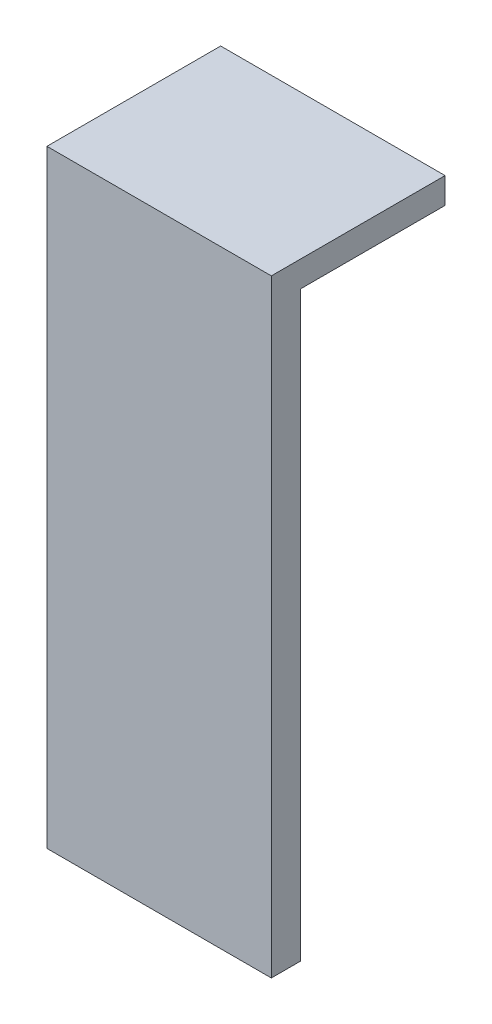
ISO-10303-21;
HEADER;
FILE_DESCRIPTION(('STEP AP214'),'2;1');
FILE_NAME('part.step','',(''),(''),'','','');
FILE_SCHEMA(('AUTOMOTIVE_DESIGN { 1 0 10303 214 1 1 1 1 }'));
ENDSEC;
DATA;
#1=APPLICATION_CONTEXT('core data for automotive mechanical design processes');
#2=APPLICATION_PROTOCOL_DEFINITION('international standard','automotive_design',2000,#1);
#3=PRODUCT_CONTEXT('',#1,'mechanical');
#4=PRODUCT('Part','Part','',(#3));
#5=PRODUCT_RELATED_PRODUCT_CATEGORY('part','',(#4));
#6=PRODUCT_DEFINITION_FORMATION('','',#4);
#7=PRODUCT_DEFINITION_CONTEXT('part definition',#1,'design');
#8=PRODUCT_DEFINITION('design','',#6,#7);
#9=PRODUCT_DEFINITION_SHAPE('','',#8);
#10=(LENGTH_UNIT() NAMED_UNIT(*) SI_UNIT(.MILLI.,.METRE.));
#11=(NAMED_UNIT(*) PLANE_ANGLE_UNIT() SI_UNIT($,.RADIAN.));
#12=(NAMED_UNIT(*) SI_UNIT($,.STERADIAN.) SOLID_ANGLE_UNIT());
#13=UNCERTAINTY_MEASURE_WITH_UNIT(LENGTH_MEASURE(1.E-05),#10,'distance_accuracy_value','');
#14=(GEOMETRIC_REPRESENTATION_CONTEXT(3) GLOBAL_UNCERTAINTY_ASSIGNED_CONTEXT((#13)) GLOBAL_UNIT_ASSIGNED_CONTEXT((#10,
#11,#12)) REPRESENTATION_CONTEXT('',''));
#15=CARTESIAN_POINT('',(0.,0.,0.));
#16=DIRECTION('',(0.,0.,1.));
#17=DIRECTION('',(1.,0.,0.));
#18=AXIS2_PLACEMENT_3D('',#15,#16,#17);
#19=CARTESIAN_POINT('',(-4.2545,21.336,-1.016));
#20=DIRECTION('',(0.,0.,1.));
#21=DIRECTION('',(1.,0.,0.));
#22=AXIS2_PLACEMENT_3D('',#19,#20,#21);
#23=PLANE('',#22);
#24=DIRECTION('',(-1.,0.,0.));
#25=VECTOR('',#24,1.);
#26=CARTESIAN_POINT('',(3.6195,20.42775542234,-1.016));
#27=LINE('',#26,#25);
#28=CARTESIAN_POINT('',(3.61949999999999,20.42775542234,-1.016));
#29=VERTEX_POINT('',#28);
#30=CARTESIAN_POINT('',(-4.2545,20.42775542234,-1.016));
#31=VERTEX_POINT('',#30);
#32=EDGE_CURVE('E48',#29,#31,#27,.T.);
#33=ORIENTED_EDGE('',*,*,#32,.F.);
#34=DIRECTION('',(0.,-1.,0.));
#35=VECTOR('',#34,1.);
#36=CARTESIAN_POINT('',(3.61949999999999,21.336,-1.016));
#37=LINE('',#36,#35);
#38=CARTESIAN_POINT('',(3.61949999999999,0.,-1.016));
#39=VERTEX_POINT('',#38);
#40=EDGE_CURVE('E84',#29,#39,#37,.T.);
#41=ORIENTED_EDGE('',*,*,#40,.T.);
#42=DIRECTION('',(-1.,0.,0.));
#43=VECTOR('',#42,1.);
#44=CARTESIAN_POINT('',(-4.2545,0.,-1.016));
#45=LINE('',#44,#43);
#46=CARTESIAN_POINT('',(-4.2545,0.,-1.016));
#47=VERTEX_POINT('',#46);
#48=EDGE_CURVE('E88',#39,#47,#45,.T.);
#49=ORIENTED_EDGE('',*,*,#48,.T.);
#50=DIRECTION('',(0.,-1.,0.));
#51=VECTOR('',#50,1.);
#52=CARTESIAN_POINT('',(-4.2545,21.336,-1.016));
#53=LINE('',#52,#51);
#54=EDGE_CURVE('E75',#31,#47,#53,.T.);
#55=ORIENTED_EDGE('',*,*,#54,.F.);
#56=EDGE_LOOP('',(#33,#41,#49,#55));
#57=FACE_BOUND('',#56,.T.);
#58=ADVANCED_FACE('F33',(#57),#23,.F.);
#59=CARTESIAN_POINT('',(-4.2545,21.336,-1.016));
#60=DIRECTION('',(1.,0.,0.));
#61=DIRECTION('',(0.,0.,-1.));
#62=AXIS2_PLACEMENT_3D('',#59,#60,#61);
#63=PLANE('',#62);
#64=DIRECTION('',(0.,0.,1.));
#65=VECTOR('',#64,1.);
#66=CARTESIAN_POINT('',(-4.2545,0.,-1.016));
#67=LINE('',#66,#65);
#68=CARTESIAN_POINT('',(-4.2545,0.,0.));
#69=VERTEX_POINT('',#68);
#70=EDGE_CURVE('E79',#47,#69,#67,.T.);
#71=ORIENTED_EDGE('',*,*,#70,.T.);
#72=DIRECTION('',(0.,-1.,0.));
#73=VECTOR('',#72,1.);
#74=CARTESIAN_POINT('',(-4.2545,21.336,0.));
#75=LINE('',#74,#73);
#76=CARTESIAN_POINT('',(-4.2545,21.336,0.));
#77=VERTEX_POINT('',#76);
#78=EDGE_CURVE('E11',#77,#69,#75,.T.);
#79=ORIENTED_EDGE('',*,*,#78,.F.);
#80=DIRECTION('',(0.,0.,1.));
#81=VECTOR('',#80,1.);
#82=CARTESIAN_POINT('',(-4.2545,21.336,-1.016));
#83=LINE('',#82,#81);
#84=CARTESIAN_POINT('',(-4.25450000000001,21.336,-6.096));
#85=VERTEX_POINT('',#84);
#86=EDGE_CURVE('E92',#85,#77,#83,.T.);
#87=ORIENTED_EDGE('',*,*,#86,.F.);
#88=DIRECTION('',(0.,1.,0.));
#89=VECTOR('',#88,1.);
#90=CARTESIAN_POINT('',(-4.25450000000001,21.336,-6.096));
#91=LINE('',#90,#89);
#92=CARTESIAN_POINT('',(-4.25450000000001,20.42775542234,-6.096));
#93=VERTEX_POINT('',#92);
#94=EDGE_CURVE('E117',#93,#85,#91,.T.);
#95=ORIENTED_EDGE('',*,*,#94,.F.);
#96=DIRECTION('',(0.,0.,1.));
#97=VECTOR('',#96,1.);
#98=CARTESIAN_POINT('',(-4.25450000000001,20.42775542234,-6.096));
#99=LINE('',#98,#97);
#100=EDGE_CURVE('E83',#93,#31,#99,.T.);
#101=ORIENTED_EDGE('',*,*,#100,.T.);
#102=ORIENTED_EDGE('',*,*,#54,.T.);
#103=EDGE_LOOP('',(#71,#79,#87,#95,#101,#102));
#104=FACE_BOUND('',#103,.T.);
#105=ADVANCED_FACE('F35',(#104),#63,.F.);
#106=CARTESIAN_POINT('',(-4.2545,21.336,0.));
#107=DIRECTION('',(0.,0.,-1.));
#108=DIRECTION('',(-1.,0.,0.));
#109=AXIS2_PLACEMENT_3D('',#106,#107,#108);
#110=PLANE('',#109);
#111=DIRECTION('',(1.,0.,0.));
#112=VECTOR('',#111,1.);
#113=CARTESIAN_POINT('',(-4.2545,0.,0.));
#114=LINE('',#113,#112);
#115=CARTESIAN_POINT('',(3.6195,0.,0.));
#116=VERTEX_POINT('',#115);
#117=EDGE_CURVE('E96',#69,#116,#114,.T.);
#118=ORIENTED_EDGE('',*,*,#117,.T.);
#119=DIRECTION('',(0.,-1.,0.));
#120=VECTOR('',#119,1.);
#121=CARTESIAN_POINT('',(3.6195,21.336,0.));
#122=LINE('',#121,#120);
#123=CARTESIAN_POINT('',(3.6195,21.336,0.));
#124=VERTEX_POINT('',#123);
#125=EDGE_CURVE('E41',#124,#116,#122,.T.);
#126=ORIENTED_EDGE('',*,*,#125,.F.);
#127=DIRECTION('',(1.,0.,0.));
#128=VECTOR('',#127,1.);
#129=CARTESIAN_POINT('',(-4.2545,21.336,0.));
#130=LINE('',#129,#128);
#131=EDGE_CURVE('E57',#77,#124,#130,.T.);
#132=ORIENTED_EDGE('',*,*,#131,.F.);
#133=ORIENTED_EDGE('',*,*,#78,.T.);
#134=EDGE_LOOP('',(#118,#126,#132,#133));
#135=FACE_BOUND('',#134,.T.);
#136=ADVANCED_FACE('F112',(#135),#110,.F.);
#137=CARTESIAN_POINT('',(3.61949999999999,21.336,-1.016));
#138=DIRECTION('',(-1.,0.,0.));
#139=DIRECTION('',(0.,0.,1.));
#140=AXIS2_PLACEMENT_3D('',#137,#138,#139);
#141=PLANE('',#140);
#142=DIRECTION('',(0.,0.,-1.));
#143=VECTOR('',#142,1.);
#144=CARTESIAN_POINT('',(3.61949999999999,0.,-1.016));
#145=LINE('',#144,#143);
#146=EDGE_CURVE('E93',#116,#39,#145,.T.);
#147=ORIENTED_EDGE('',*,*,#146,.T.);
#148=ORIENTED_EDGE('',*,*,#40,.F.);
#149=DIRECTION('',(0.,0.,1.));
#150=VECTOR('',#149,1.);
#151=CARTESIAN_POINT('',(3.61949999999999,20.42775542234,-6.09600000000001));
#152=LINE('',#151,#150);
#153=CARTESIAN_POINT('',(3.61949999999999,20.42775542234,-6.09600000000001));
#154=VERTEX_POINT('',#153);
#155=EDGE_CURVE('E97',#154,#29,#152,.T.);
#156=ORIENTED_EDGE('',*,*,#155,.F.);
#157=DIRECTION('',(0.,-1.,0.));
#158=VECTOR('',#157,1.);
#159=CARTESIAN_POINT('',(3.61949999999999,21.336,-6.09600000000001));
#160=LINE('',#159,#158);
#161=CARTESIAN_POINT('',(3.61949999999999,21.336,-6.09600000000001));
#162=VERTEX_POINT('',#161);
#163=EDGE_CURVE('E135',#162,#154,#160,.T.);
#164=ORIENTED_EDGE('',*,*,#163,.F.);
#165=DIRECTION('',(0.,0.,-1.));
#166=VECTOR('',#165,1.);
#167=CARTESIAN_POINT('',(3.61949999999999,21.336,-1.016));
#168=LINE('',#167,#166);
#169=EDGE_CURVE('E85',#124,#162,#168,.T.);
#170=ORIENTED_EDGE('',*,*,#169,.F.);
#171=ORIENTED_EDGE('',*,*,#125,.T.);
#172=EDGE_LOOP('',(#147,#148,#156,#164,#170,#171));
#173=FACE_BOUND('',#172,.T.);
#174=ADVANCED_FACE('F109',(#173),#141,.F.);
#175=CARTESIAN_POINT('',(0.,21.336,0.));
#176=DIRECTION('',(0.,1.,0.));
#177=DIRECTION('',(0.,0.,1.));
#178=AXIS2_PLACEMENT_3D('',#175,#176,#177);
#179=PLANE('',#178);
#180=ORIENTED_EDGE('',*,*,#86,.T.);
#181=ORIENTED_EDGE('',*,*,#131,.T.);
#182=ORIENTED_EDGE('',*,*,#169,.T.);
#183=DIRECTION('',(1.,0.,0.));
#184=VECTOR('',#183,1.);
#185=CARTESIAN_POINT('',(3.61949999999999,21.336,-6.09600000000001));
#186=LINE('',#185,#184);
#187=EDGE_CURVE('E126',#85,#162,#186,.T.);
#188=ORIENTED_EDGE('',*,*,#187,.F.);
#189=EDGE_LOOP('',(#180,#181,#182,#188));
#190=FACE_BOUND('',#189,.T.);
#191=ADVANCED_FACE('F130',(#190),#179,.T.);
#192=CARTESIAN_POINT('',(0.,0.,0.));
#193=DIRECTION('',(0.,1.,0.));
#194=DIRECTION('',(0.,0.,1.));
#195=AXIS2_PLACEMENT_3D('',#192,#193,#194);
#196=PLANE('',#195);
#197=ORIENTED_EDGE('',*,*,#70,.F.);
#198=ORIENTED_EDGE('',*,*,#48,.F.);
#199=ORIENTED_EDGE('',*,*,#146,.F.);
#200=ORIENTED_EDGE('',*,*,#117,.F.);
#201=EDGE_LOOP('',(#197,#198,#199,#200));
#202=FACE_BOUND('',#201,.T.);
#203=ADVANCED_FACE('F95',(#202),#196,.F.);
#204=CARTESIAN_POINT('',(3.61949999999999,20.42775542234,-6.09600000000001));
#205=DIRECTION('',(0.,1.,0.));
#206=DIRECTION('',(0.,0.,1.));
#207=AXIS2_PLACEMENT_3D('',#204,#205,#206);
#208=PLANE('',#207);
#209=ORIENTED_EDGE('',*,*,#32,.T.);
#210=ORIENTED_EDGE('',*,*,#100,.F.);
#211=DIRECTION('',(-1.,0.,0.));
#212=VECTOR('',#211,1.);
#213=CARTESIAN_POINT('',(3.61949999999999,20.42775542234,-6.09600000000001));
#214=LINE('',#213,#212);
#215=EDGE_CURVE('E128',#154,#93,#214,.T.);
#216=ORIENTED_EDGE('',*,*,#215,.F.);
#217=ORIENTED_EDGE('',*,*,#155,.T.);
#218=EDGE_LOOP('',(#209,#210,#216,#217));
#219=FACE_BOUND('',#218,.T.);
#220=ADVANCED_FACE('F141',(#219),#208,.F.);
#221=CARTESIAN_POINT('',(0.,0.,-6.096));
#222=DIRECTION('',(0.,0.,-1.));
#223=DIRECTION('',(-1.,0.,0.));
#224=AXIS2_PLACEMENT_3D('',#221,#222,#223);
#225=PLANE('',#224);
#226=ORIENTED_EDGE('',*,*,#163,.T.);
#227=ORIENTED_EDGE('',*,*,#215,.T.);
#228=ORIENTED_EDGE('',*,*,#94,.T.);
#229=ORIENTED_EDGE('',*,*,#187,.T.);
#230=EDGE_LOOP('',(#226,#227,#228,#229));
#231=FACE_BOUND('',#230,.T.);
#232=ADVANCED_FACE('F125',(#231),#225,.T.);
#233=CLOSED_SHELL('',(#58,#105,#136,#174,#191,#203,#220,#232));
#234=MANIFOLD_SOLID_BREP('B2',#233);
#235=ADVANCED_BREP_SHAPE_REPRESENTATION('',(#18,#234),#14);
#236=SHAPE_DEFINITION_REPRESENTATION(#9,#235);
ENDSEC;
END-ISO-10303-21;
